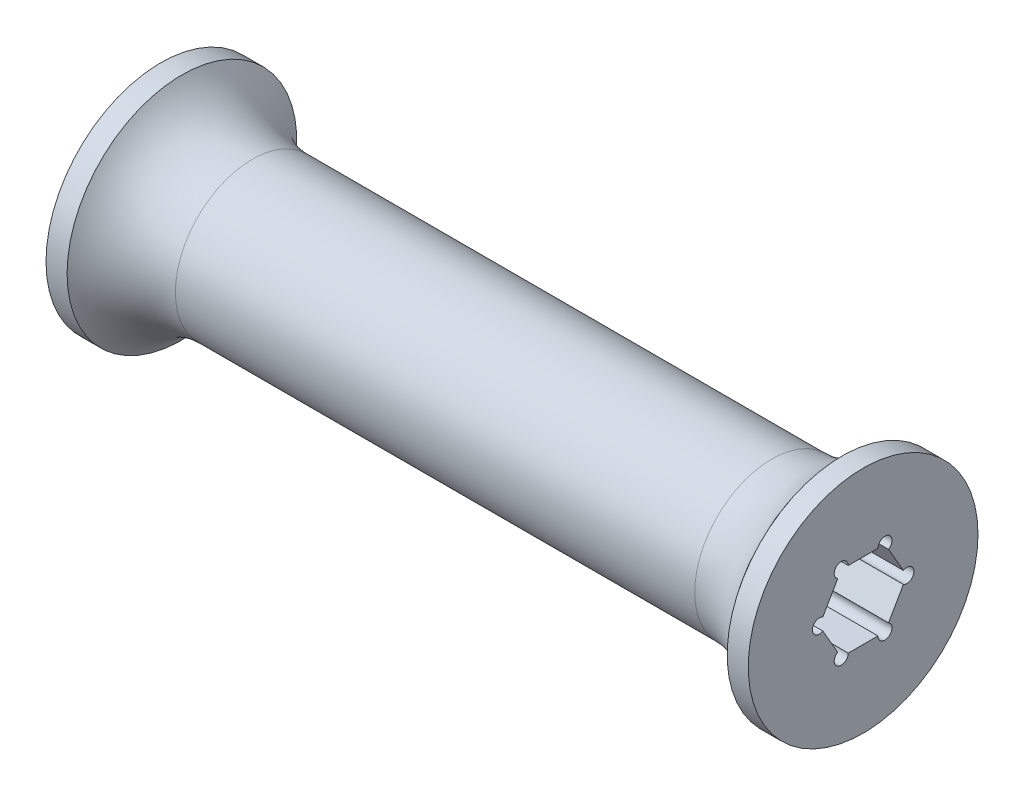
ISO-10303-21;
HEADER;
FILE_DESCRIPTION(('STEP AP214'),'2;1');
FILE_NAME('part.step','',(''),(''),'','','');
FILE_SCHEMA(('AUTOMOTIVE_DESIGN { 1 0 10303 214 1 1 1 1 }'));
ENDSEC;
DATA;
#1=APPLICATION_CONTEXT('core data for automotive mechanical design processes');
#2=APPLICATION_PROTOCOL_DEFINITION('international standard','automotive_design',2000,#1);
#3=PRODUCT_CONTEXT('',#1,'mechanical');
#4=PRODUCT('Part','Part','',(#3));
#5=PRODUCT_RELATED_PRODUCT_CATEGORY('part','',(#4));
#6=PRODUCT_DEFINITION_FORMATION('','',#4);
#7=PRODUCT_DEFINITION_CONTEXT('part definition',#1,'design');
#8=PRODUCT_DEFINITION('design','',#6,#7);
#9=PRODUCT_DEFINITION_SHAPE('','',#8);
#10=(LENGTH_UNIT() NAMED_UNIT(*) SI_UNIT(.MILLI.,.METRE.));
#11=(NAMED_UNIT(*) PLANE_ANGLE_UNIT() SI_UNIT($,.RADIAN.));
#12=(NAMED_UNIT(*) SI_UNIT($,.STERADIAN.) SOLID_ANGLE_UNIT());
#13=UNCERTAINTY_MEASURE_WITH_UNIT(LENGTH_MEASURE(1.E-05),#10,'distance_accuracy_value','');
#14=(GEOMETRIC_REPRESENTATION_CONTEXT(3) GLOBAL_UNCERTAINTY_ASSIGNED_CONTEXT((#13)) GLOBAL_UNIT_ASSIGNED_CONTEXT((#10,
#11,#12)) REPRESENTATION_CONTEXT('',''));
#15=CARTESIAN_POINT('',(0.,0.,0.));
#16=DIRECTION('',(0.,0.,1.));
#17=DIRECTION('',(1.,0.,0.));
#18=AXIS2_PLACEMENT_3D('',#15,#16,#17);
#19=CARTESIAN_POINT('',(63.5,81.28,-364.49));
#20=DIRECTION('',(-1.,0.,0.));
#21=DIRECTION('',(0.,0.,1.));
#22=AXIS2_PLACEMENT_3D('',#19,#20,#21);
#23=CYLINDRICAL_SURFACE('',#22,13.9185840345284);
#24=CARTESIAN_POINT('',(46.9620906665706,81.28,-364.49));
#25=DIRECTION('',(1.,0.,0.));
#26=DIRECTION('',(0.,0.,-1.));
#27=AXIS2_PLACEMENT_3D('',#24,#25,#26);
#28=CIRCLE('',#27,13.9185840345284);
#29=CARTESIAN_POINT('',(46.9620906665706,81.28,-378.408584034528));
#30=VERTEX_POINT('',#29);
#31=EDGE_CURVE('E11',#30,#30,#28,.F.);
#32=ORIENTED_EDGE('',*,*,#31,.T.);
#33=EDGE_LOOP('',(#32));
#34=FACE_BOUND('',#33,.T.);
#35=CARTESIAN_POINT('',(-46.9620906665706,81.28,-364.49));
#36=DIRECTION('',(-1.,0.,0.));
#37=DIRECTION('',(0.,0.,1.));
#38=AXIS2_PLACEMENT_3D('',#35,#36,#37);
#39=CIRCLE('',#38,13.9185840345284);
#40=CARTESIAN_POINT('',(-46.9620906665706,81.28,-350.571415965472));
#41=VERTEX_POINT('',#40);
#42=EDGE_CURVE('E40',#41,#41,#39,.F.);
#43=ORIENTED_EDGE('',*,*,#42,.T.);
#44=EDGE_LOOP('',(#43));
#45=FACE_BOUND('',#44,.T.);
#46=ADVANCED_FACE('F32',(#34,#45),#23,.T.);
#47=CARTESIAN_POINT('',(-59.69,81.28,-364.49));
#48=DIRECTION('',(-1.,0.,0.));
#49=DIRECTION('',(0.,0.,1.));
#50=AXIS2_PLACEMENT_3D('',#47,#48,#49);
#51=CYLINDRICAL_SURFACE('',#50,20.7765840345284);
#52=CARTESIAN_POINT('',(-59.69,81.28,-364.49));
#53=DIRECTION('',(-1.,0.,0.));
#54=DIRECTION('',(0.,0.,1.));
#55=AXIS2_PLACEMENT_3D('',#52,#53,#54);
#56=CIRCLE('',#55,20.7765840345284);
#57=CARTESIAN_POINT('',(-59.69,81.28,-343.713415965472));
#58=VERTEX_POINT('',#57);
#59=EDGE_CURVE('E228',#58,#58,#56,.T.);
#60=CARTESIAN_POINT('',(-63.5,81.28,-364.49));
#61=DIRECTION('',(-1.,0.,0.));
#62=DIRECTION('',(0.,0.,1.));
#63=AXIS2_PLACEMENT_3D('',#60,#61,#62);
#64=CIRCLE('',#63,20.7765840345284);
#65=CARTESIAN_POINT('',(-63.5,81.28,-343.713415965472));
#66=VERTEX_POINT('',#65);
#67=EDGE_CURVE('E225',#66,#66,#64,.T.);
#68=CARTESIAN_POINT('',(-59.69,81.28,-343.713415965472));
#69=CARTESIAN_POINT('',(-59.7296875,81.28,-343.713415965472));
#70=CARTESIAN_POINT('',(-59.769375,81.28,-343.713415965472));
#71=CARTESIAN_POINT('',(-59.84875,81.28,-343.713415965472));
#72=CARTESIAN_POINT('',(-59.8884375,81.28,-343.713415965472));
#73=CARTESIAN_POINT('',(-59.9678125,81.28,-343.713415965472));
#74=CARTESIAN_POINT('',(-60.0075,81.28,-343.713415965472));
#75=CARTESIAN_POINT('',(-60.086875,81.28,-343.713415965472));
#76=CARTESIAN_POINT('',(-60.1265625,81.28,-343.713415965472));
#77=CARTESIAN_POINT('',(-60.2059375,81.28,-343.713415965472));
#78=CARTESIAN_POINT('',(-60.245625,81.28,-343.713415965472));
#79=CARTESIAN_POINT('',(-60.325,81.28,-343.713415965472));
#80=CARTESIAN_POINT('',(-60.3646875,81.28,-343.713415965472));
#81=CARTESIAN_POINT('',(-60.4440625,81.28,-343.713415965472));
#82=CARTESIAN_POINT('',(-60.48375,81.28,-343.713415965472));
#83=CARTESIAN_POINT('',(-60.563125,81.28,-343.713415965472));
#84=CARTESIAN_POINT('',(-60.6028125,81.28,-343.713415965472));
#85=CARTESIAN_POINT('',(-60.6821875,81.28,-343.713415965472));
#86=CARTESIAN_POINT('',(-60.721875,81.28,-343.713415965472));
#87=CARTESIAN_POINT('',(-60.80125,81.28,-343.713415965472));
#88=CARTESIAN_POINT('',(-60.8409375,81.28,-343.713415965472));
#89=CARTESIAN_POINT('',(-60.9203125,81.28,-343.713415965472));
#90=CARTESIAN_POINT('',(-60.96,81.28,-343.713415965472));
#91=CARTESIAN_POINT('',(-61.039375,81.28,-343.713415965472));
#92=CARTESIAN_POINT('',(-61.0790625,81.28,-343.713415965472));
#93=CARTESIAN_POINT('',(-61.1584375,81.28,-343.713415965472));
#94=CARTESIAN_POINT('',(-61.198125,81.28,-343.713415965472));
#95=CARTESIAN_POINT('',(-61.2775,81.28,-343.713415965472));
#96=CARTESIAN_POINT('',(-61.3171875,81.28,-343.713415965472));
#97=CARTESIAN_POINT('',(-61.3965625,81.28,-343.713415965472));
#98=CARTESIAN_POINT('',(-61.43625,81.28,-343.713415965472));
#99=CARTESIAN_POINT('',(-61.515625,81.28,-343.713415965472));
#100=CARTESIAN_POINT('',(-61.5553125,81.28,-343.713415965472));
#101=CARTESIAN_POINT('',(-61.6346875,81.28,-343.713415965472));
#102=CARTESIAN_POINT('',(-61.674375,81.28,-343.713415965472));
#103=CARTESIAN_POINT('',(-61.75375,81.28,-343.713415965472));
#104=CARTESIAN_POINT('',(-61.7934375,81.28,-343.713415965472));
#105=CARTESIAN_POINT('',(-61.8728125,81.28,-343.713415965472));
#106=CARTESIAN_POINT('',(-61.9125,81.28,-343.713415965472));
#107=CARTESIAN_POINT('',(-61.991875,81.28,-343.713415965472));
#108=CARTESIAN_POINT('',(-62.0315625,81.28,-343.713415965472));
#109=CARTESIAN_POINT('',(-62.1109375,81.28,-343.713415965472));
#110=CARTESIAN_POINT('',(-62.150625,81.28,-343.713415965472));
#111=CARTESIAN_POINT('',(-62.23,81.28,-343.713415965472));
#112=CARTESIAN_POINT('',(-62.2696875,81.28,-343.713415965472));
#113=CARTESIAN_POINT('',(-62.3490625,81.28,-343.713415965472));
#114=CARTESIAN_POINT('',(-62.38875,81.28,-343.713415965472));
#115=CARTESIAN_POINT('',(-62.468125,81.28,-343.713415965472));
#116=CARTESIAN_POINT('',(-62.5078125,81.28,-343.713415965472));
#117=CARTESIAN_POINT('',(-62.5871875,81.28,-343.713415965472));
#118=CARTESIAN_POINT('',(-62.626875,81.28,-343.713415965472));
#119=CARTESIAN_POINT('',(-62.70625,81.28,-343.713415965472));
#120=CARTESIAN_POINT('',(-62.7459375,81.28,-343.713415965472));
#121=CARTESIAN_POINT('',(-62.8253125,81.28,-343.713415965472));
#122=CARTESIAN_POINT('',(-62.865,81.28,-343.713415965472));
#123=CARTESIAN_POINT('',(-62.944375,81.28,-343.713415965472));
#124=CARTESIAN_POINT('',(-62.9840625,81.28,-343.713415965472));
#125=CARTESIAN_POINT('',(-63.0634375,81.28,-343.713415965472));
#126=CARTESIAN_POINT('',(-63.103125,81.28,-343.713415965472));
#127=CARTESIAN_POINT('',(-63.1825,81.28,-343.713415965472));
#128=CARTESIAN_POINT('',(-63.2221875,81.28,-343.713415965472));
#129=CARTESIAN_POINT('',(-63.3015625,81.28,-343.713415965472));
#130=CARTESIAN_POINT('',(-63.34125,81.28,-343.713415965472));
#131=CARTESIAN_POINT('',(-63.420625,81.28,-343.713415965472));
#132=CARTESIAN_POINT('',(-63.4603125,81.28,-343.713415965472));
#133=CARTESIAN_POINT('',(-63.5,81.28,-343.713415965472));
#134=B_SPLINE_CURVE_WITH_KNOTS('',3,(#68,#69,#70,#71,#72,#73,#74,#75,#76,#77,#78,#79,#80,#81,
#82,#83,#84,#85,#86,#87,#88,#89,#90,#91,#92,#93,#94,#95,#96,#97,#98,#99,#100,#101,#102,#103,
#104,#105,#106,#107,#108,#109,#110,#111,#112,#113,#114,#115,#116,#117,#118,#119,#120,#121,#122,
#123,#124,#125,#126,#127,#128,#129,#130,#131,#132,#133),.UNSPECIFIED.,.F.,.F.,(4,2,2,2,2,2,2,2,
2,2,2,2,2,2,2,2,2,2,2,2,2,2,2,2,2,2,2,2,2,2,2,2,4),(0.,0.119062499999996,0.238124999999999,
0.357187499999995,0.476249999999998,0.595312499999993,0.714374999999996,0.833437499999999,
0.952499999999995,1.0715625,1.19062499999999,1.3096875,1.42874999999999,1.5478125,1.666875,
1.78593749999999,1.905,2.02406249999999,2.143125,2.26218749999999,2.38124999999999,2.5003125,
2.61937499999999,2.7384375,2.85749999999999,2.97656249999999,3.095625,3.2146875,
3.33374999999999,3.45281249999999,3.571875,3.6909375,3.80999999999999),.UNSPECIFIED.);
#135=EDGE_CURVE('BSEAM242',#58,#66,#134,.T.);
#136=ORIENTED_EDGE('',*,*,#59,.T.);
#137=ORIENTED_EDGE('',*,*,#67,.F.);
#138=ORIENTED_EDGE('',*,*,#135,.T.);
#139=ORIENTED_EDGE('',*,*,#135,.F.);
#140=EDGE_LOOP('',(#136,#138,#137,#139));
#141=FACE_BOUND('',#140,.T.);
#142=ADVANCED_FACE('F242',(#141),#51,.T.);
#143=CARTESIAN_POINT('',(-63.5,81.28,-364.49));
#144=DIRECTION('',(1.,0.,0.));
#145=DIRECTION('',(0.,0.,-1.));
#146=AXIS2_PLACEMENT_3D('',#143,#144,#145);
#147=PLANE('',#146);
#148=DIRECTION('',(0.,0.86602540378444,-0.499999999999998));
#149=VECTOR('',#148,1.);
#150=CARTESIAN_POINT('',(-63.5,-140.937799712695,-244.111429809355));
#151=LINE('',#150,#149);
#152=CARTESIAN_POINT('',(-63.5,75.5218522628062,-369.084468146102));
#153=VERTEX_POINT('',#152);
#154=CARTESIAN_POINT('',(-63.5,80.1801477371938,-371.773936292205));
#155=VERTEX_POINT('',#154);
#156=EDGE_CURVE('E129',#153,#155,#151,.T.);
#157=ORIENTED_EDGE('',*,*,#156,.T.);
#158=CARTESIAN_POINT('',(-63.5,81.28,-372.408936292205));
#159=DIRECTION('',(1.,0.,0.));
#160=DIRECTION('',(0.,0.,-1.));
#161=AXIS2_PLACEMENT_3D('',#158,#159,#160);
#162=CIRCLE('',#161,1.26999999999998);
#163=CARTESIAN_POINT('',(-63.5,82.3798522628062,-371.773936292205));
#164=VERTEX_POINT('',#163);
#165=EDGE_CURVE('E123',#155,#164,#162,.T.);
#166=ORIENTED_EDGE('',*,*,#165,.T.);
#167=DIRECTION('',(0.,0.866025403784438,0.500000000000002));
#168=VECTOR('',#167,1.);
#169=CARTESIAN_POINT('',(-63.5,181.577799712696,-314.501974628953));
#170=LINE('',#169,#168);
#171=CARTESIAN_POINT('',(-63.5,87.0381477371939,-369.084468146102));
#172=VERTEX_POINT('',#171);
#173=EDGE_CURVE('E132',#164,#172,#170,.T.);
#174=ORIENTED_EDGE('',*,*,#173,.T.);
#175=CARTESIAN_POINT('',(-63.5,88.1380000000001,-368.449468146102));
#176=DIRECTION('',(1.,0.,0.));
#177=DIRECTION('',(0.,0.,-1.));
#178=AXIS2_PLACEMENT_3D('',#175,#176,#177);
#179=CIRCLE('',#178,1.26999999999998);
#180=CARTESIAN_POINT('',(-63.5,88.1380000000001,-367.179468146102));
#181=VERTEX_POINT('',#180);
#182=EDGE_CURVE('E47',#172,#181,#179,.T.);
#183=ORIENTED_EDGE('',*,*,#182,.T.);
#184=DIRECTION('',(0.,0.,1.));
#185=VECTOR('',#184,1.);
#186=CARTESIAN_POINT('',(-63.5,88.1380000000001,0.));
#187=LINE('',#186,#185);
#188=CARTESIAN_POINT('',(-63.5,88.1380000000001,-361.800531853898));
#189=VERTEX_POINT('',#188);
#190=EDGE_CURVE('E147',#181,#189,#187,.T.);
#191=ORIENTED_EDGE('',*,*,#190,.T.);
#192=CARTESIAN_POINT('',(-63.5,88.1380000000001,-360.530531853898));
#193=DIRECTION('',(1.,0.,0.));
#194=DIRECTION('',(0.,0.,-1.));
#195=AXIS2_PLACEMENT_3D('',#192,#193,#194);
#196=CIRCLE('',#195,1.26999999999998);
#197=CARTESIAN_POINT('',(-63.5,87.0381477371939,-359.895531853898));
#198=VERTEX_POINT('',#197);
#199=EDGE_CURVE('E150',#189,#198,#196,.T.);
#200=ORIENTED_EDGE('',*,*,#199,.T.);
#201=DIRECTION('',(0.,-0.866025403784437,0.500000000000003));
#202=VECTOR('',#201,1.);
#203=CARTESIAN_POINT('',(-63.5,-134.079799712695,-232.233025371046));
#204=LINE('',#203,#202);
#205=CARTESIAN_POINT('',(-63.5,82.3798522628063,-357.206063707795));
#206=VERTEX_POINT('',#205);
#207=EDGE_CURVE('E153',#198,#206,#204,.T.);
#208=ORIENTED_EDGE('',*,*,#207,.T.);
#209=CARTESIAN_POINT('',(-63.5,81.2800000000001,-356.571063707795));
#210=DIRECTION('',(1.,0.,0.));
#211=DIRECTION('',(0.,0.,-1.));
#212=AXIS2_PLACEMENT_3D('',#209,#210,#211);
#213=CIRCLE('',#212,1.26999999999998);
#214=CARTESIAN_POINT('',(-63.5,80.1801477371939,-357.206063707795));
#215=VERTEX_POINT('',#214);
#216=EDGE_CURVE('E156',#206,#215,#213,.T.);
#217=ORIENTED_EDGE('',*,*,#216,.T.);
#218=DIRECTION('',(0.,-0.866025403784438,-0.500000000000002));
#219=VECTOR('',#218,1.);
#220=CARTESIAN_POINT('',(-63.5,174.719799712696,-302.623570190645));
#221=LINE('',#220,#219);
#222=CARTESIAN_POINT('',(-63.5,75.5218522628062,-359.895531853898));
#223=VERTEX_POINT('',#222);
#224=EDGE_CURVE('E159',#215,#223,#221,.T.);
#225=ORIENTED_EDGE('',*,*,#224,.T.);
#226=CARTESIAN_POINT('',(-63.5,74.422,-360.530531853898));
#227=DIRECTION('',(1.,0.,0.));
#228=DIRECTION('',(0.,0.,-1.));
#229=AXIS2_PLACEMENT_3D('',#226,#227,#228);
#230=CIRCLE('',#229,1.26999999999998);
#231=CARTESIAN_POINT('',(-63.5,74.422,-361.800531853898));
#232=VERTEX_POINT('',#231);
#233=EDGE_CURVE('E162',#223,#232,#230,.T.);
#234=ORIENTED_EDGE('',*,*,#233,.T.);
#235=DIRECTION('',(0.,0.,-1.));
#236=VECTOR('',#235,1.);
#237=CARTESIAN_POINT('',(-63.5,74.422,0.));
#238=LINE('',#237,#236);
#239=CARTESIAN_POINT('',(-63.5,74.422,-367.179468146103));
#240=VERTEX_POINT('',#239);
#241=EDGE_CURVE('E165',#232,#240,#238,.T.);
#242=ORIENTED_EDGE('',*,*,#241,.T.);
#243=CARTESIAN_POINT('',(-63.5,74.422,-368.449468146103));
#244=DIRECTION('',(1.,0.,0.));
#245=DIRECTION('',(0.,0.,-1.));
#246=AXIS2_PLACEMENT_3D('',#243,#244,#245);
#247=CIRCLE('',#246,1.26999999999998);
#248=EDGE_CURVE('E168',#240,#153,#247,.T.);
#249=ORIENTED_EDGE('',*,*,#248,.T.);
#250=EDGE_LOOP('',(#157,#166,#174,#183,#191,#200,#208,#217,#225,#234,#242,#249));
#251=FACE_BOUND('',#250,.T.);
#252=ORIENTED_EDGE('',*,*,#67,.T.);
#253=EDGE_LOOP('',(#252));
#254=FACE_BOUND('',#253,.T.);
#255=ADVANCED_FACE('F136',(#251,#254),#147,.F.);
#256=CARTESIAN_POINT('',(-46.9620906665706,81.28,-364.49));
#257=DIRECTION('',(-1.,0.,0.));
#258=DIRECTION('',(0.,0.,1.));
#259=AXIS2_PLACEMENT_3D('',#256,#257,#258);
#260=TOROIDAL_SURFACE('',#259,29.1585840345284,15.24);
#261=ORIENTED_EDGE('',*,*,#42,.F.);
#262=EDGE_LOOP('',(#261));
#263=FACE_BOUND('',#262,.T.);
#264=ORIENTED_EDGE('',*,*,#59,.F.);
#265=EDGE_LOOP('',(#264));
#266=FACE_BOUND('',#265,.T.);
#267=ADVANCED_FACE('F236',(#263,#266),#260,.F.);
#268=CARTESIAN_POINT('',(59.69,81.28,-364.49));
#269=DIRECTION('',(1.,0.,0.));
#270=DIRECTION('',(0.,0.,-1.));
#271=AXIS2_PLACEMENT_3D('',#268,#269,#270);
#272=CYLINDRICAL_SURFACE('',#271,20.7765840345284);
#273=CARTESIAN_POINT('',(59.69,81.28,-364.49));
#274=DIRECTION('',(1.,0.,0.));
#275=DIRECTION('',(0.,0.,-1.));
#276=AXIS2_PLACEMENT_3D('',#273,#274,#275);
#277=CIRCLE('',#276,20.7765840345284);
#278=CARTESIAN_POINT('',(59.69,81.28,-385.266584034528));
#279=VERTEX_POINT('',#278);
#280=EDGE_CURVE('E222',#279,#279,#277,.T.);
#281=CARTESIAN_POINT('',(63.5,81.28,-364.49));
#282=DIRECTION('',(1.,0.,0.));
#283=DIRECTION('',(0.,0.,-1.));
#284=AXIS2_PLACEMENT_3D('',#281,#282,#283);
#285=CIRCLE('',#284,20.7765840345284);
#286=CARTESIAN_POINT('',(63.5,81.28,-385.266584034528));
#287=VERTEX_POINT('',#286);
#288=EDGE_CURVE('E202',#287,#287,#285,.T.);
#289=CARTESIAN_POINT('',(59.69,81.28,-385.266584034528));
#290=CARTESIAN_POINT('',(59.7296875,81.28,-385.266584034528));
#291=CARTESIAN_POINT('',(59.769375,81.28,-385.266584034528));
#292=CARTESIAN_POINT('',(59.84875,81.28,-385.266584034528));
#293=CARTESIAN_POINT('',(59.8884375,81.28,-385.266584034528));
#294=CARTESIAN_POINT('',(59.9678125,81.28,-385.266584034528));
#295=CARTESIAN_POINT('',(60.0075,81.28,-385.266584034528));
#296=CARTESIAN_POINT('',(60.086875,81.28,-385.266584034528));
#297=CARTESIAN_POINT('',(60.1265625,81.28,-385.266584034528));
#298=CARTESIAN_POINT('',(60.2059375,81.28,-385.266584034528));
#299=CARTESIAN_POINT('',(60.245625,81.28,-385.266584034528));
#300=CARTESIAN_POINT('',(60.325,81.28,-385.266584034528));
#301=CARTESIAN_POINT('',(60.3646875,81.28,-385.266584034528));
#302=CARTESIAN_POINT('',(60.4440625,81.28,-385.266584034528));
#303=CARTESIAN_POINT('',(60.48375,81.28,-385.266584034528));
#304=CARTESIAN_POINT('',(60.563125,81.28,-385.266584034528));
#305=CARTESIAN_POINT('',(60.6028125,81.28,-385.266584034528));
#306=CARTESIAN_POINT('',(60.6821875,81.28,-385.266584034528));
#307=CARTESIAN_POINT('',(60.721875,81.28,-385.266584034528));
#308=CARTESIAN_POINT('',(60.80125,81.28,-385.266584034528));
#309=CARTESIAN_POINT('',(60.8409375,81.28,-385.266584034528));
#310=CARTESIAN_POINT('',(60.9203125,81.28,-385.266584034528));
#311=CARTESIAN_POINT('',(60.96,81.28,-385.266584034528));
#312=CARTESIAN_POINT('',(61.039375,81.28,-385.266584034528));
#313=CARTESIAN_POINT('',(61.0790625,81.28,-385.266584034528));
#314=CARTESIAN_POINT('',(61.1584375,81.28,-385.266584034528));
#315=CARTESIAN_POINT('',(61.198125,81.28,-385.266584034528));
#316=CARTESIAN_POINT('',(61.2775,81.28,-385.266584034528));
#317=CARTESIAN_POINT('',(61.3171875,81.28,-385.266584034528));
#318=CARTESIAN_POINT('',(61.3965625,81.28,-385.266584034528));
#319=CARTESIAN_POINT('',(61.43625,81.28,-385.266584034528));
#320=CARTESIAN_POINT('',(61.515625,81.28,-385.266584034528));
#321=CARTESIAN_POINT('',(61.5553125,81.28,-385.266584034528));
#322=CARTESIAN_POINT('',(61.6346875,81.28,-385.266584034528));
#323=CARTESIAN_POINT('',(61.674375,81.28,-385.266584034528));
#324=CARTESIAN_POINT('',(61.75375,81.28,-385.266584034528));
#325=CARTESIAN_POINT('',(61.7934375,81.28,-385.266584034528));
#326=CARTESIAN_POINT('',(61.8728125,81.28,-385.266584034528));
#327=CARTESIAN_POINT('',(61.9125,81.28,-385.266584034528));
#328=CARTESIAN_POINT('',(61.991875,81.28,-385.266584034528));
#329=CARTESIAN_POINT('',(62.0315625,81.28,-385.266584034528));
#330=CARTESIAN_POINT('',(62.1109375,81.28,-385.266584034528));
#331=CARTESIAN_POINT('',(62.150625,81.28,-385.266584034528));
#332=CARTESIAN_POINT('',(62.23,81.28,-385.266584034528));
#333=CARTESIAN_POINT('',(62.2696875,81.28,-385.266584034528));
#334=CARTESIAN_POINT('',(62.3490625,81.28,-385.266584034528));
#335=CARTESIAN_POINT('',(62.38875,81.28,-385.266584034528));
#336=CARTESIAN_POINT('',(62.468125,81.28,-385.266584034528));
#337=CARTESIAN_POINT('',(62.5078125,81.28,-385.266584034528));
#338=CARTESIAN_POINT('',(62.5871875,81.28,-385.266584034528));
#339=CARTESIAN_POINT('',(62.626875,81.28,-385.266584034528));
#340=CARTESIAN_POINT('',(62.70625,81.28,-385.266584034528));
#341=CARTESIAN_POINT('',(62.7459375,81.28,-385.266584034528));
#342=CARTESIAN_POINT('',(62.8253125,81.28,-385.266584034528));
#343=CARTESIAN_POINT('',(62.865,81.28,-385.266584034528));
#344=CARTESIAN_POINT('',(62.944375,81.28,-385.266584034528));
#345=CARTESIAN_POINT('',(62.9840625,81.28,-385.266584034528));
#346=CARTESIAN_POINT('',(63.0634375,81.28,-385.266584034528));
#347=CARTESIAN_POINT('',(63.103125,81.28,-385.266584034528));
#348=CARTESIAN_POINT('',(63.1825,81.28,-385.266584034528));
#349=CARTESIAN_POINT('',(63.2221875,81.28,-385.266584034528));
#350=CARTESIAN_POINT('',(63.3015625,81.28,-385.266584034528));
#351=CARTESIAN_POINT('',(63.34125,81.28,-385.266584034528));
#352=CARTESIAN_POINT('',(63.420625,81.28,-385.266584034528));
#353=CARTESIAN_POINT('',(63.4603125,81.28,-385.266584034528));
#354=CARTESIAN_POINT('',(63.5,81.28,-385.266584034528));
#355=B_SPLINE_CURVE_WITH_KNOTS('',3,(#289,#290,#291,#292,#293,#294,#295,#296,#297,#298,#299,
#300,#301,#302,#303,#304,#305,#306,#307,#308,#309,#310,#311,#312,#313,#314,#315,#316,#317,#318,
#319,#320,#321,#322,#323,#324,#325,#326,#327,#328,#329,#330,#331,#332,#333,#334,#335,#336,#337,
#338,#339,#340,#341,#342,#343,#344,#345,#346,#347,#348,#349,#350,#351,#352,#353,#354),
.UNSPECIFIED.,.F.,.F.,(4,2,2,2,2,2,2,2,2,2,2,2,2,2,2,2,2,2,2,2,2,2,2,2,2,2,2,2,2,2,2,2,4),(0.,
0.119062499999996,0.238124999999999,0.357187499999995,0.476249999999998,0.595312499999993,
0.714374999999996,0.833437499999999,0.952499999999995,1.0715625,1.19062499999999,1.3096875,
1.42874999999999,1.5478125,1.666875,1.78593749999999,1.905,2.02406249999999,2.143125,
2.26218749999999,2.38124999999999,2.5003125,2.61937499999999,2.7384375,2.85749999999999,
2.97656249999999,3.095625,3.2146875,3.33374999999999,3.45281249999999,3.571875,3.6909375,
3.80999999999999),.UNSPECIFIED.);
#356=EDGE_CURVE('BSEAM239',#279,#287,#355,.T.);
#357=ORIENTED_EDGE('',*,*,#280,.T.);
#358=ORIENTED_EDGE('',*,*,#288,.F.);
#359=ORIENTED_EDGE('',*,*,#356,.T.);
#360=ORIENTED_EDGE('',*,*,#356,.F.);
#361=EDGE_LOOP('',(#357,#359,#358,#360));
#362=FACE_BOUND('',#361,.T.);
#363=ADVANCED_FACE('F239',(#362),#272,.T.);
#364=CARTESIAN_POINT('',(63.5,81.28,-364.49));
#365=DIRECTION('',(1.,0.,0.));
#366=DIRECTION('',(0.,0.,-1.));
#367=AXIS2_PLACEMENT_3D('',#364,#365,#366);
#368=PLANE('',#367);
#369=CARTESIAN_POINT('',(63.5,81.28,-372.408936292205));
#370=DIRECTION('',(1.,0.,0.));
#371=DIRECTION('',(0.,0.,-1.));
#372=AXIS2_PLACEMENT_3D('',#369,#370,#371);
#373=CIRCLE('',#372,1.26999999999998);
#374=CARTESIAN_POINT('',(63.5,80.1801477371938,-371.773936292205));
#375=VERTEX_POINT('',#374);
#376=CARTESIAN_POINT('',(63.5,82.3798522628062,-371.773936292205));
#377=VERTEX_POINT('',#376);
#378=EDGE_CURVE('E55',#375,#377,#373,.T.);
#379=ORIENTED_EDGE('',*,*,#378,.F.);
#380=DIRECTION('',(0.,0.86602540378444,-0.499999999999998));
#381=VECTOR('',#380,1.);
#382=CARTESIAN_POINT('',(63.5,-140.937799712695,-244.111429809355));
#383=LINE('',#382,#381);
#384=CARTESIAN_POINT('',(63.5,75.5218522628062,-369.084468146102));
#385=VERTEX_POINT('',#384);
#386=EDGE_CURVE('E140',#385,#375,#383,.T.);
#387=ORIENTED_EDGE('',*,*,#386,.F.);
#388=CARTESIAN_POINT('',(63.5,74.422,-368.449468146103));
#389=DIRECTION('',(1.,0.,0.));
#390=DIRECTION('',(0.,0.,-1.));
#391=AXIS2_PLACEMENT_3D('',#388,#389,#390);
#392=CIRCLE('',#391,1.26999999999998);
#393=CARTESIAN_POINT('',(63.5,74.422,-367.179468146103));
#394=VERTEX_POINT('',#393);
#395=EDGE_CURVE('E143',#394,#385,#392,.T.);
#396=ORIENTED_EDGE('',*,*,#395,.F.);
#397=DIRECTION('',(0.,0.,-1.));
#398=VECTOR('',#397,1.);
#399=CARTESIAN_POINT('',(63.5,74.422,0.));
#400=LINE('',#399,#398);
#401=CARTESIAN_POINT('',(63.5,74.422,-361.800531853898));
#402=VERTEX_POINT('',#401);
#403=EDGE_CURVE('E195',#402,#394,#400,.T.);
#404=ORIENTED_EDGE('',*,*,#403,.F.);
#405=CARTESIAN_POINT('',(63.5,74.422,-360.530531853898));
#406=DIRECTION('',(1.,0.,0.));
#407=DIRECTION('',(0.,0.,-1.));
#408=AXIS2_PLACEMENT_3D('',#405,#406,#407);
#409=CIRCLE('',#408,1.26999999999998);
#410=CARTESIAN_POINT('',(63.5,75.5218522628062,-359.895531853898));
#411=VERTEX_POINT('',#410);
#412=EDGE_CURVE('E192',#411,#402,#409,.T.);
#413=ORIENTED_EDGE('',*,*,#412,.F.);
#414=DIRECTION('',(0.,-0.866025403784438,-0.500000000000002));
#415=VECTOR('',#414,1.);
#416=CARTESIAN_POINT('',(63.5,174.719799712696,-302.623570190645));
#417=LINE('',#416,#415);
#418=CARTESIAN_POINT('',(63.5,80.1801477371939,-357.206063707795));
#419=VERTEX_POINT('',#418);
#420=EDGE_CURVE('E189',#419,#411,#417,.T.);
#421=ORIENTED_EDGE('',*,*,#420,.F.);
#422=CARTESIAN_POINT('',(63.5,81.2800000000001,-356.571063707795));
#423=DIRECTION('',(1.,0.,0.));
#424=DIRECTION('',(0.,0.,-1.));
#425=AXIS2_PLACEMENT_3D('',#422,#423,#424);
#426=CIRCLE('',#425,1.26999999999998);
#427=CARTESIAN_POINT('',(63.5,82.3798522628063,-357.206063707795));
#428=VERTEX_POINT('',#427);
#429=EDGE_CURVE('E186',#428,#419,#426,.T.);
#430=ORIENTED_EDGE('',*,*,#429,.F.);
#431=DIRECTION('',(0.,-0.866025403784437,0.500000000000003));
#432=VECTOR('',#431,1.);
#433=CARTESIAN_POINT('',(63.5,-134.079799712695,-232.233025371046));
#434=LINE('',#433,#432);
#435=CARTESIAN_POINT('',(63.5,87.0381477371939,-359.895531853898));
#436=VERTEX_POINT('',#435);
#437=EDGE_CURVE('E183',#436,#428,#434,.T.);
#438=ORIENTED_EDGE('',*,*,#437,.F.);
#439=CARTESIAN_POINT('',(63.5,88.1380000000001,-360.530531853898));
#440=DIRECTION('',(1.,0.,0.));
#441=DIRECTION('',(0.,0.,-1.));
#442=AXIS2_PLACEMENT_3D('',#439,#440,#441);
#443=CIRCLE('',#442,1.26999999999998);
#444=CARTESIAN_POINT('',(63.5,88.1380000000001,-361.800531853898));
#445=VERTEX_POINT('',#444);
#446=EDGE_CURVE('E180',#445,#436,#443,.T.);
#447=ORIENTED_EDGE('',*,*,#446,.F.);
#448=DIRECTION('',(0.,0.,1.));
#449=VECTOR('',#448,1.);
#450=CARTESIAN_POINT('',(63.5,88.1380000000001,0.));
#451=LINE('',#450,#449);
#452=CARTESIAN_POINT('',(63.5,88.1380000000001,-367.179468146102));
#453=VERTEX_POINT('',#452);
#454=EDGE_CURVE('E177',#453,#445,#451,.T.);
#455=ORIENTED_EDGE('',*,*,#454,.F.);
#456=CARTESIAN_POINT('',(63.5,88.1380000000001,-368.449468146102));
#457=DIRECTION('',(1.,0.,0.));
#458=DIRECTION('',(0.,0.,-1.));
#459=AXIS2_PLACEMENT_3D('',#456,#457,#458);
#460=CIRCLE('',#459,1.26999999999998);
#461=CARTESIAN_POINT('',(63.5,87.0381477371939,-369.084468146102));
#462=VERTEX_POINT('',#461);
#463=EDGE_CURVE('E174',#462,#453,#460,.T.);
#464=ORIENTED_EDGE('',*,*,#463,.F.);
#465=DIRECTION('',(0.,0.866025403784438,0.500000000000002));
#466=VECTOR('',#465,1.);
#467=CARTESIAN_POINT('',(63.5,181.577799712696,-314.501974628953));
#468=LINE('',#467,#466);
#469=EDGE_CURVE('E172',#377,#462,#468,.T.);
#470=ORIENTED_EDGE('',*,*,#469,.F.);
#471=EDGE_LOOP('',(#379,#387,#396,#404,#413,#421,#430,#438,#447,#455,#464,#470));
#472=FACE_BOUND('',#471,.T.);
#473=ORIENTED_EDGE('',*,*,#288,.T.);
#474=EDGE_LOOP('',(#473));
#475=FACE_BOUND('',#474,.T.);
#476=ADVANCED_FACE('F261',(#472,#475),#368,.T.);
#477=CARTESIAN_POINT('',(46.9620906665706,81.28,-364.49));
#478=DIRECTION('',(1.,0.,0.));
#479=DIRECTION('',(0.,0.,-1.));
#480=AXIS2_PLACEMENT_3D('',#477,#478,#479);
#481=TOROIDAL_SURFACE('',#480,29.1585840345284,15.24);
#482=ORIENTED_EDGE('',*,*,#31,.F.);
#483=EDGE_LOOP('',(#482));
#484=FACE_BOUND('',#483,.T.);
#485=ORIENTED_EDGE('',*,*,#280,.F.);
#486=EDGE_LOOP('',(#485));
#487=FACE_BOUND('',#486,.T.);
#488=ADVANCED_FACE('F34',(#484,#487),#481,.F.);
#489=CARTESIAN_POINT('',(-63.5,81.28,-372.408936292205));
#490=DIRECTION('',(1.,0.,0.));
#491=DIRECTION('',(0.,0.,-1.));
#492=AXIS2_PLACEMENT_3D('',#489,#490,#491);
#493=CYLINDRICAL_SURFACE('',#492,1.26999999999998);
#494=ORIENTED_EDGE('',*,*,#378,.T.);
#495=DIRECTION('',(1.,0.,0.));
#496=VECTOR('',#495,1.);
#497=CARTESIAN_POINT('',(-63.5,82.3798522628062,-371.773936292205));
#498=LINE('',#497,#496);
#499=EDGE_CURVE('E119',#164,#377,#498,.T.);
#500=ORIENTED_EDGE('',*,*,#499,.F.);
#501=ORIENTED_EDGE('',*,*,#165,.F.);
#502=DIRECTION('',(1.,0.,0.));
#503=VECTOR('',#502,1.);
#504=CARTESIAN_POINT('',(-63.5,80.1801477371938,-371.773936292205));
#505=LINE('',#504,#503);
#506=EDGE_CURVE('E200',#155,#375,#505,.T.);
#507=ORIENTED_EDGE('',*,*,#506,.T.);
#508=EDGE_LOOP('',(#494,#500,#501,#507));
#509=FACE_BOUND('',#508,.T.);
#510=ADVANCED_FACE('F121',(#509),#493,.F.);
#511=CARTESIAN_POINT('',(-63.5,-140.937799712695,-244.111429809355));
#512=DIRECTION('',(0.,-0.499999999999998,-0.86602540378444));
#513=DIRECTION('',(0.,0.86602540378444,-0.499999999999998));
#514=AXIS2_PLACEMENT_3D('',#511,#512,#513);
#515=PLANE('',#514);
#516=ORIENTED_EDGE('',*,*,#386,.T.);
#517=ORIENTED_EDGE('',*,*,#506,.F.);
#518=ORIENTED_EDGE('',*,*,#156,.F.);
#519=DIRECTION('',(1.,0.,0.));
#520=VECTOR('',#519,1.);
#521=CARTESIAN_POINT('',(-63.5,75.5218522628062,-369.084468146102));
#522=LINE('',#521,#520);
#523=EDGE_CURVE('E203',#153,#385,#522,.T.);
#524=ORIENTED_EDGE('',*,*,#523,.T.);
#525=EDGE_LOOP('',(#516,#517,#518,#524));
#526=FACE_BOUND('',#525,.T.);
#527=ADVANCED_FACE('F276',(#526),#515,.F.);
#528=CARTESIAN_POINT('',(-63.5,74.422,-368.449468146103));
#529=DIRECTION('',(1.,0.,0.));
#530=DIRECTION('',(0.,0.,-1.));
#531=AXIS2_PLACEMENT_3D('',#528,#529,#530);
#532=CYLINDRICAL_SURFACE('',#531,1.26999999999998);
#533=ORIENTED_EDGE('',*,*,#395,.T.);
#534=ORIENTED_EDGE('',*,*,#523,.F.);
#535=ORIENTED_EDGE('',*,*,#248,.F.);
#536=DIRECTION('',(1.,0.,0.));
#537=VECTOR('',#536,1.);
#538=CARTESIAN_POINT('',(-63.5,74.422,-367.179468146103));
#539=LINE('',#538,#537);
#540=EDGE_CURVE('E205',#240,#394,#539,.T.);
#541=ORIENTED_EDGE('',*,*,#540,.T.);
#542=EDGE_LOOP('',(#533,#534,#535,#541));
#543=FACE_BOUND('',#542,.T.);
#544=ADVANCED_FACE('F309',(#543),#532,.F.);
#545=CARTESIAN_POINT('',(-63.5,74.422,0.));
#546=DIRECTION('',(0.,-1.,0.));
#547=DIRECTION('',(0.,0.,-1.));
#548=AXIS2_PLACEMENT_3D('',#545,#546,#547);
#549=PLANE('',#548);
#550=ORIENTED_EDGE('',*,*,#403,.T.);
#551=ORIENTED_EDGE('',*,*,#540,.F.);
#552=ORIENTED_EDGE('',*,*,#241,.F.);
#553=DIRECTION('',(1.,0.,0.));
#554=VECTOR('',#553,1.);
#555=CARTESIAN_POINT('',(-63.5,74.422,-361.800531853898));
#556=LINE('',#555,#554);
#557=EDGE_CURVE('E207',#232,#402,#556,.T.);
#558=ORIENTED_EDGE('',*,*,#557,.T.);
#559=EDGE_LOOP('',(#550,#551,#552,#558));
#560=FACE_BOUND('',#559,.T.);
#561=ADVANCED_FACE('F305',(#560),#549,.F.);
#562=CARTESIAN_POINT('',(-63.5,74.422,-360.530531853898));
#563=DIRECTION('',(1.,0.,0.));
#564=DIRECTION('',(0.,0.,-1.));
#565=AXIS2_PLACEMENT_3D('',#562,#563,#564);
#566=CYLINDRICAL_SURFACE('',#565,1.26999999999998);
#567=ORIENTED_EDGE('',*,*,#412,.T.);
#568=ORIENTED_EDGE('',*,*,#557,.F.);
#569=ORIENTED_EDGE('',*,*,#233,.F.);
#570=DIRECTION('',(1.,0.,0.));
#571=VECTOR('',#570,1.);
#572=CARTESIAN_POINT('',(-63.5,75.5218522628062,-359.895531853898));
#573=LINE('',#572,#571);
#574=EDGE_CURVE('E209',#223,#411,#573,.T.);
#575=ORIENTED_EDGE('',*,*,#574,.T.);
#576=EDGE_LOOP('',(#567,#568,#569,#575));
#577=FACE_BOUND('',#576,.T.);
#578=ADVANCED_FACE('F301',(#577),#566,.F.);
#579=CARTESIAN_POINT('',(-63.5,174.719799712696,-302.623570190645));
#580=DIRECTION('',(0.,-0.500000000000002,0.866025403784437));
#581=DIRECTION('',(0.,-0.866025403784438,-0.500000000000002));
#582=AXIS2_PLACEMENT_3D('',#579,#580,#581);
#583=PLANE('',#582);
#584=ORIENTED_EDGE('',*,*,#420,.T.);
#585=ORIENTED_EDGE('',*,*,#574,.F.);
#586=ORIENTED_EDGE('',*,*,#224,.F.);
#587=DIRECTION('',(1.,0.,0.));
#588=VECTOR('',#587,1.);
#589=CARTESIAN_POINT('',(-63.5,80.1801477371939,-357.206063707795));
#590=LINE('',#589,#588);
#591=EDGE_CURVE('E211',#215,#419,#590,.T.);
#592=ORIENTED_EDGE('',*,*,#591,.T.);
#593=EDGE_LOOP('',(#584,#585,#586,#592));
#594=FACE_BOUND('',#593,.T.);
#595=ADVANCED_FACE('F297',(#594),#583,.F.);
#596=CARTESIAN_POINT('',(-63.5,81.2800000000001,-356.571063707795));
#597=DIRECTION('',(1.,0.,0.));
#598=DIRECTION('',(0.,0.,-1.));
#599=AXIS2_PLACEMENT_3D('',#596,#597,#598);
#600=CYLINDRICAL_SURFACE('',#599,1.26999999999998);
#601=ORIENTED_EDGE('',*,*,#429,.T.);
#602=ORIENTED_EDGE('',*,*,#591,.F.);
#603=ORIENTED_EDGE('',*,*,#216,.F.);
#604=DIRECTION('',(1.,0.,0.));
#605=VECTOR('',#604,1.);
#606=CARTESIAN_POINT('',(-63.5,82.3798522628063,-357.206063707795));
#607=LINE('',#606,#605);
#608=EDGE_CURVE('E213',#206,#428,#607,.T.);
#609=ORIENTED_EDGE('',*,*,#608,.T.);
#610=EDGE_LOOP('',(#601,#602,#603,#609));
#611=FACE_BOUND('',#610,.T.);
#612=ADVANCED_FACE('F293',(#611),#600,.F.);
#613=CARTESIAN_POINT('',(-63.5,-134.079799712695,-232.233025371046));
#614=DIRECTION('',(0.,0.500000000000003,0.866025403784437));
#615=DIRECTION('',(0.,-0.866025403784437,0.500000000000003));
#616=AXIS2_PLACEMENT_3D('',#613,#614,#615);
#617=PLANE('',#616);
#618=ORIENTED_EDGE('',*,*,#437,.T.);
#619=ORIENTED_EDGE('',*,*,#608,.F.);
#620=ORIENTED_EDGE('',*,*,#207,.F.);
#621=DIRECTION('',(1.,0.,0.));
#622=VECTOR('',#621,1.);
#623=CARTESIAN_POINT('',(-63.5,87.0381477371939,-359.895531853898));
#624=LINE('',#623,#622);
#625=EDGE_CURVE('E215',#198,#436,#624,.T.);
#626=ORIENTED_EDGE('',*,*,#625,.T.);
#627=EDGE_LOOP('',(#618,#619,#620,#626));
#628=FACE_BOUND('',#627,.T.);
#629=ADVANCED_FACE('F289',(#628),#617,.F.);
#630=CARTESIAN_POINT('',(-63.5,88.1380000000001,-360.530531853898));
#631=DIRECTION('',(1.,0.,0.));
#632=DIRECTION('',(0.,0.,-1.));
#633=AXIS2_PLACEMENT_3D('',#630,#631,#632);
#634=CYLINDRICAL_SURFACE('',#633,1.26999999999998);
#635=ORIENTED_EDGE('',*,*,#446,.T.);
#636=ORIENTED_EDGE('',*,*,#625,.F.);
#637=ORIENTED_EDGE('',*,*,#199,.F.);
#638=DIRECTION('',(1.,0.,0.));
#639=VECTOR('',#638,1.);
#640=CARTESIAN_POINT('',(-63.5,88.1380000000001,-361.800531853898));
#641=LINE('',#640,#639);
#642=EDGE_CURVE('E217',#189,#445,#641,.T.);
#643=ORIENTED_EDGE('',*,*,#642,.T.);
#644=EDGE_LOOP('',(#635,#636,#637,#643));
#645=FACE_BOUND('',#644,.T.);
#646=ADVANCED_FACE('F285',(#645),#634,.F.);
#647=CARTESIAN_POINT('',(-63.5,88.1380000000001,0.));
#648=DIRECTION('',(0.,1.,0.));
#649=DIRECTION('',(0.,0.,1.));
#650=AXIS2_PLACEMENT_3D('',#647,#648,#649);
#651=PLANE('',#650);
#652=ORIENTED_EDGE('',*,*,#454,.T.);
#653=ORIENTED_EDGE('',*,*,#642,.F.);
#654=ORIENTED_EDGE('',*,*,#190,.F.);
#655=DIRECTION('',(1.,0.,0.));
#656=VECTOR('',#655,1.);
#657=CARTESIAN_POINT('',(-63.5,88.1380000000001,-367.179468146102));
#658=LINE('',#657,#656);
#659=EDGE_CURVE('E219',#181,#453,#658,.T.);
#660=ORIENTED_EDGE('',*,*,#659,.T.);
#661=EDGE_LOOP('',(#652,#653,#654,#660));
#662=FACE_BOUND('',#661,.T.);
#663=ADVANCED_FACE('F282',(#662),#651,.F.);
#664=CARTESIAN_POINT('',(-63.5,88.1380000000001,-368.449468146102));
#665=DIRECTION('',(1.,0.,0.));
#666=DIRECTION('',(0.,0.,-1.));
#667=AXIS2_PLACEMENT_3D('',#664,#665,#666);
#668=CYLINDRICAL_SURFACE('',#667,1.26999999999998);
#669=ORIENTED_EDGE('',*,*,#463,.T.);
#670=ORIENTED_EDGE('',*,*,#659,.F.);
#671=ORIENTED_EDGE('',*,*,#182,.F.);
#672=DIRECTION('',(1.,0.,0.));
#673=VECTOR('',#672,1.);
#674=CARTESIAN_POINT('',(-63.5,87.0381477371939,-369.084468146102));
#675=LINE('',#674,#673);
#676=EDGE_CURVE('E128',#172,#462,#675,.T.);
#677=ORIENTED_EDGE('',*,*,#676,.T.);
#678=EDGE_LOOP('',(#669,#670,#671,#677));
#679=FACE_BOUND('',#678,.T.);
#680=ADVANCED_FACE('F279',(#679),#668,.F.);
#681=CARTESIAN_POINT('',(-63.5,181.577799712696,-314.501974628953));
#682=DIRECTION('',(0.,0.500000000000002,-0.866025403784437));
#683=DIRECTION('',(0.,0.866025403784438,0.500000000000002));
#684=AXIS2_PLACEMENT_3D('',#681,#682,#683);
#685=PLANE('',#684);
#686=ORIENTED_EDGE('',*,*,#469,.T.);
#687=ORIENTED_EDGE('',*,*,#676,.F.);
#688=ORIENTED_EDGE('',*,*,#173,.F.);
#689=ORIENTED_EDGE('',*,*,#499,.T.);
#690=EDGE_LOOP('',(#686,#687,#688,#689));
#691=FACE_BOUND('',#690,.T.);
#692=ADVANCED_FACE('F133',(#691),#685,.F.);
#693=CLOSED_SHELL('',(#46,#142,#255,#267,#363,#476,#488,#510,#527,#544,#561,#578,#595,#612,#629,
#646,#663,#680,#692));
#694=MANIFOLD_SOLID_BREP('B2',#693);
#695=ADVANCED_BREP_SHAPE_REPRESENTATION('',(#18,#694),#14);
#696=SHAPE_DEFINITION_REPRESENTATION(#9,#695);
ENDSEC;
END-ISO-10303-21;
